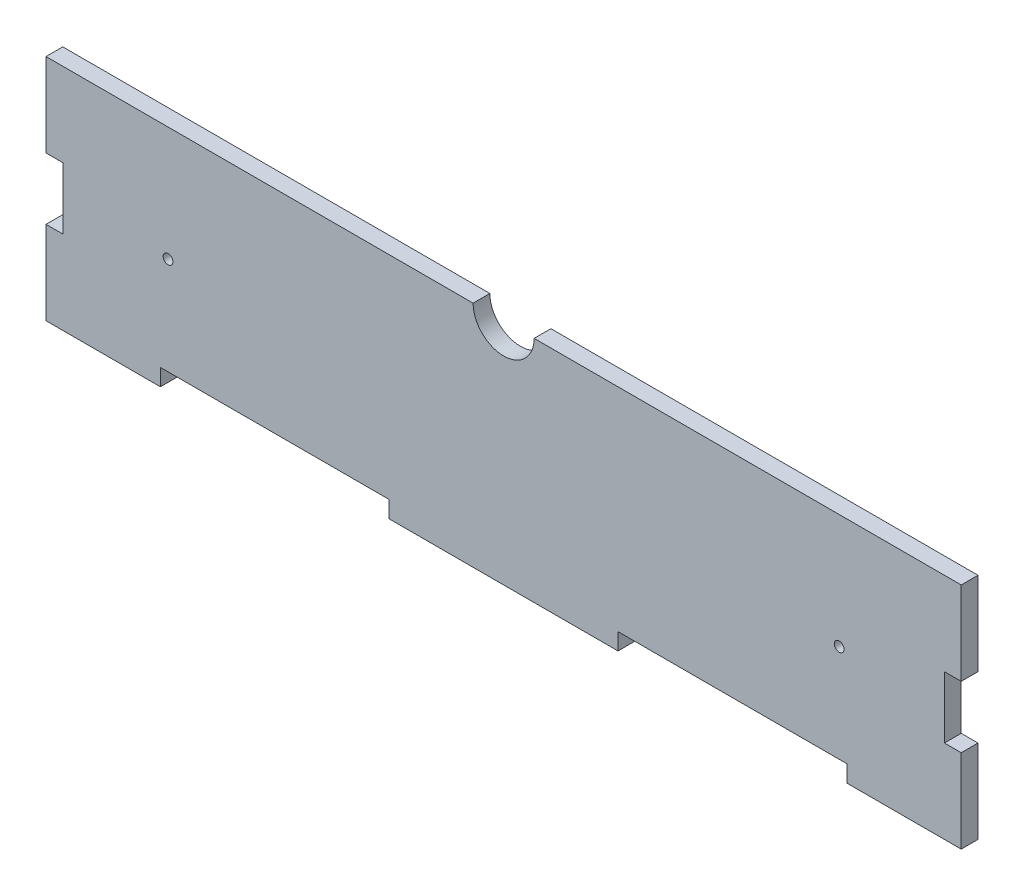
ISO-10303-21;
HEADER;
FILE_DESCRIPTION(('STEP AP214'),'2;1');
FILE_NAME('part.step','',(''),(''),'','','');
FILE_SCHEMA(('AUTOMOTIVE_DESIGN { 1 0 10303 214 1 1 1 1 }'));
ENDSEC;
DATA;
#1=APPLICATION_CONTEXT('core data for automotive mechanical design processes');
#2=APPLICATION_PROTOCOL_DEFINITION('international standard','automotive_design',2000,#1);
#3=PRODUCT_CONTEXT('',#1,'mechanical');
#4=PRODUCT('Part','Part','',(#3));
#5=PRODUCT_RELATED_PRODUCT_CATEGORY('part','',(#4));
#6=PRODUCT_DEFINITION_FORMATION('','',#4);
#7=PRODUCT_DEFINITION_CONTEXT('part definition',#1,'design');
#8=PRODUCT_DEFINITION('design','',#6,#7);
#9=PRODUCT_DEFINITION_SHAPE('','',#8);
#10=(LENGTH_UNIT() NAMED_UNIT(*) SI_UNIT(.MILLI.,.METRE.));
#11=(NAMED_UNIT(*) PLANE_ANGLE_UNIT() SI_UNIT($,.RADIAN.));
#12=(NAMED_UNIT(*) SI_UNIT($,.STERADIAN.) SOLID_ANGLE_UNIT());
#13=UNCERTAINTY_MEASURE_WITH_UNIT(LENGTH_MEASURE(1.E-05),#10,'distance_accuracy_value','');
#14=(GEOMETRIC_REPRESENTATION_CONTEXT(3) GLOBAL_UNCERTAINTY_ASSIGNED_CONTEXT((#13)) GLOBAL_UNIT_ASSIGNED_CONTEXT((#10,
#11,#12)) REPRESENTATION_CONTEXT('',''));
#15=CARTESIAN_POINT('',(0.,0.,0.));
#16=DIRECTION('',(0.,0.,1.));
#17=DIRECTION('',(1.,0.,0.));
#18=AXIS2_PLACEMENT_3D('',#15,#16,#17);
#19=CARTESIAN_POINT('',(300.,78.,5.5));
#20=DIRECTION('',(0.,-1.,0.));
#21=DIRECTION('',(0.,0.,-1.));
#22=AXIS2_PLACEMENT_3D('',#19,#20,#21);
#23=PLANE('',#22);
#24=DIRECTION('',(0.,0.,-1.));
#25=VECTOR('',#24,1.);
#26=CARTESIAN_POINT('',(140.,78.,5.5));
#27=LINE('',#26,#25);
#28=CARTESIAN_POINT('',(140.,78.,0.));
#29=VERTEX_POINT('',#28);
#30=CARTESIAN_POINT('',(140.,78.,5.5));
#31=VERTEX_POINT('',#30);
#32=EDGE_CURVE('E365',#29,#31,#27,.F.);
#33=ORIENTED_EDGE('',*,*,#32,.F.);
#34=DIRECTION('',(-1.,0.,0.));
#35=VECTOR('',#34,1.);
#36=CARTESIAN_POINT('',(300.,78.,0.));
#37=LINE('',#36,#35);
#38=CARTESIAN_POINT('',(0.,78.,0.));
#39=VERTEX_POINT('',#38);
#40=EDGE_CURVE('E228',#29,#39,#37,.T.);
#41=ORIENTED_EDGE('',*,*,#40,.T.);
#42=DIRECTION('',(0.,0.,-1.));
#43=VECTOR('',#42,1.);
#44=CARTESIAN_POINT('',(0.,78.,5.5));
#45=LINE('',#44,#43);
#46=CARTESIAN_POINT('',(0.,78.,5.5));
#47=VERTEX_POINT('',#46);
#48=EDGE_CURVE('E47',#47,#39,#45,.T.);
#49=ORIENTED_EDGE('',*,*,#48,.F.);
#50=DIRECTION('',(-1.,0.,0.));
#51=VECTOR('',#50,1.);
#52=CARTESIAN_POINT('',(300.,78.,5.5));
#53=LINE('',#52,#51);
#54=EDGE_CURVE('E139',#31,#47,#53,.T.);
#55=ORIENTED_EDGE('',*,*,#54,.F.);
#56=EDGE_LOOP('',(#33,#41,#49,#55));
#57=FACE_BOUND('',#56,.T.);
#58=ADVANCED_FACE('F39',(#57),#23,.F.);
#59=DIRECTION('',(0.,0.,-1.));
#60=VECTOR('',#59,1.);
#61=CARTESIAN_POINT('',(160.,78.,5.5));
#62=LINE('',#61,#60);
#63=CARTESIAN_POINT('',(160.,78.,5.5));
#64=VERTEX_POINT('',#63);
#65=CARTESIAN_POINT('',(160.,78.,0.));
#66=VERTEX_POINT('',#65);
#67=EDGE_CURVE('E53',#64,#66,#62,.T.);
#68=ORIENTED_EDGE('',*,*,#67,.F.);
#69=CARTESIAN_POINT('',(300.,78.,5.5));
#70=VERTEX_POINT('',#69);
#71=EDGE_CURVE('E440',#70,#64,#53,.T.);
#72=ORIENTED_EDGE('',*,*,#71,.F.);
#73=DIRECTION('',(0.,0.,-1.));
#74=VECTOR('',#73,1.);
#75=CARTESIAN_POINT('',(300.,78.,5.5));
#76=LINE('',#75,#74);
#77=CARTESIAN_POINT('',(300.,78.,0.));
#78=VERTEX_POINT('',#77);
#79=EDGE_CURVE('E219',#70,#78,#76,.T.);
#80=ORIENTED_EDGE('',*,*,#79,.T.);
#81=EDGE_CURVE('E223',#78,#66,#37,.T.);
#82=ORIENTED_EDGE('',*,*,#81,.T.);
#83=EDGE_LOOP('',(#68,#72,#80,#82));
#84=FACE_BOUND('',#83,.T.);
#85=ADVANCED_FACE('F441',(#84),#23,.F.);
#86=CARTESIAN_POINT('',(0.,78.,5.5));
#87=DIRECTION('',(1.,0.,0.));
#88=DIRECTION('',(0.,0.,-1.));
#89=AXIS2_PLACEMENT_3D('',#86,#87,#88);
#90=PLANE('',#89);
#91=DIRECTION('',(0.,-1.,0.));
#92=VECTOR('',#91,1.);
#93=CARTESIAN_POINT('',(0.,78.,0.));
#94=LINE('',#93,#92);
#95=CARTESIAN_POINT('',(0.,50.625,0.));
#96=VERTEX_POINT('',#95);
#97=EDGE_CURVE('E227',#39,#96,#94,.T.);
#98=ORIENTED_EDGE('',*,*,#97,.T.);
#99=DIRECTION('',(0.,0.,-1.));
#100=VECTOR('',#99,1.);
#101=CARTESIAN_POINT('',(0.,50.625,5.5));
#102=LINE('',#101,#100);
#103=CARTESIAN_POINT('',(0.,50.625,5.5));
#104=VERTEX_POINT('',#103);
#105=EDGE_CURVE('E349',#104,#96,#102,.T.);
#106=ORIENTED_EDGE('',*,*,#105,.F.);
#107=DIRECTION('',(0.,-1.,0.));
#108=VECTOR('',#107,1.);
#109=CARTESIAN_POINT('',(0.,78.,5.5));
#110=LINE('',#109,#108);
#111=EDGE_CURVE('E359',#47,#104,#110,.T.);
#112=ORIENTED_EDGE('',*,*,#111,.F.);
#113=ORIENTED_EDGE('',*,*,#48,.T.);
#114=EDGE_LOOP('',(#98,#106,#112,#113));
#115=FACE_BOUND('',#114,.T.);
#116=ADVANCED_FACE('F356',(#115),#90,.F.);
#117=CARTESIAN_POINT('',(0.,50.625,5.5));
#118=DIRECTION('',(0.,1.,0.));
#119=DIRECTION('',(0.,0.,1.));
#120=AXIS2_PLACEMENT_3D('',#117,#118,#119);
#121=PLANE('',#120);
#122=DIRECTION('',(1.,0.,0.));
#123=VECTOR('',#122,1.);
#124=CARTESIAN_POINT('',(0.,50.625,0.));
#125=LINE('',#124,#123);
#126=CARTESIAN_POINT('',(5.5,50.625,0.));
#127=VERTEX_POINT('',#126);
#128=EDGE_CURVE('E231',#96,#127,#125,.T.);
#129=ORIENTED_EDGE('',*,*,#128,.T.);
#130=DIRECTION('',(0.,0.,-1.));
#131=VECTOR('',#130,1.);
#132=CARTESIAN_POINT('',(5.5,50.625,5.5));
#133=LINE('',#132,#131);
#134=CARTESIAN_POINT('',(5.5,50.625,5.5));
#135=VERTEX_POINT('',#134);
#136=EDGE_CURVE('E345',#135,#127,#133,.T.);
#137=ORIENTED_EDGE('',*,*,#136,.F.);
#138=DIRECTION('',(1.,0.,0.));
#139=VECTOR('',#138,1.);
#140=CARTESIAN_POINT('',(0.,50.625,5.5));
#141=LINE('',#140,#139);
#142=EDGE_CURVE('E384',#104,#135,#141,.T.);
#143=ORIENTED_EDGE('',*,*,#142,.F.);
#144=ORIENTED_EDGE('',*,*,#105,.T.);
#145=EDGE_LOOP('',(#129,#137,#143,#144));
#146=FACE_BOUND('',#145,.T.);
#147=ADVANCED_FACE('F374',(#146),#121,.F.);
#148=CARTESIAN_POINT('',(5.5,38.875,5.5));
#149=DIRECTION('',(1.,0.,0.));
#150=DIRECTION('',(0.,0.,-1.));
#151=AXIS2_PLACEMENT_3D('',#148,#149,#150);
#152=PLANE('',#151);
#153=DIRECTION('',(0.,-1.,0.));
#154=VECTOR('',#153,1.);
#155=CARTESIAN_POINT('',(5.5,38.875,0.));
#156=LINE('',#155,#154);
#157=CARTESIAN_POINT('',(5.5,30.375,0.));
#158=VERTEX_POINT('',#157);
#159=EDGE_CURVE('E235',#127,#158,#156,.T.);
#160=ORIENTED_EDGE('',*,*,#159,.T.);
#161=DIRECTION('',(0.,0.,-1.));
#162=VECTOR('',#161,1.);
#163=CARTESIAN_POINT('',(5.5,30.375,5.5));
#164=LINE('',#163,#162);
#165=CARTESIAN_POINT('',(5.5,30.375,5.5));
#166=VERTEX_POINT('',#165);
#167=EDGE_CURVE('E341',#166,#158,#164,.T.);
#168=ORIENTED_EDGE('',*,*,#167,.F.);
#169=DIRECTION('',(0.,-1.,0.));
#170=VECTOR('',#169,1.);
#171=CARTESIAN_POINT('',(5.5,50.625,5.5));
#172=LINE('',#171,#170);
#173=EDGE_CURVE('E380',#135,#166,#172,.T.);
#174=ORIENTED_EDGE('',*,*,#173,.F.);
#175=ORIENTED_EDGE('',*,*,#136,.T.);
#176=EDGE_LOOP('',(#160,#168,#174,#175));
#177=FACE_BOUND('',#176,.T.);
#178=ADVANCED_FACE('F378',(#177),#152,.F.);
#179=CARTESIAN_POINT('',(5.5,30.375,5.5));
#180=DIRECTION('',(0.,-1.,0.));
#181=DIRECTION('',(0.,0.,-1.));
#182=AXIS2_PLACEMENT_3D('',#179,#180,#181);
#183=PLANE('',#182);
#184=DIRECTION('',(-1.,0.,0.));
#185=VECTOR('',#184,1.);
#186=CARTESIAN_POINT('',(5.5,30.375,0.));
#187=LINE('',#186,#185);
#188=CARTESIAN_POINT('',(0.,30.375,0.));
#189=VERTEX_POINT('',#188);
#190=EDGE_CURVE('E238',#158,#189,#187,.T.);
#191=ORIENTED_EDGE('',*,*,#190,.T.);
#192=DIRECTION('',(0.,0.,-1.));
#193=VECTOR('',#192,1.);
#194=CARTESIAN_POINT('',(0.,30.375,5.5));
#195=LINE('',#194,#193);
#196=CARTESIAN_POINT('',(0.,30.375,5.5));
#197=VERTEX_POINT('',#196);
#198=EDGE_CURVE('E337',#197,#189,#195,.T.);
#199=ORIENTED_EDGE('',*,*,#198,.F.);
#200=DIRECTION('',(-1.,0.,0.));
#201=VECTOR('',#200,1.);
#202=CARTESIAN_POINT('',(5.5,30.375,5.5));
#203=LINE('',#202,#201);
#204=EDGE_CURVE('E383',#166,#197,#203,.T.);
#205=ORIENTED_EDGE('',*,*,#204,.F.);
#206=ORIENTED_EDGE('',*,*,#167,.T.);
#207=EDGE_LOOP('',(#191,#199,#205,#206));
#208=FACE_BOUND('',#207,.T.);
#209=ADVANCED_FACE('F507',(#208),#183,.F.);
#210=CARTESIAN_POINT('',(0.,30.375,5.5));
#211=DIRECTION('',(1.,0.,0.));
#212=DIRECTION('',(0.,0.,-1.));
#213=AXIS2_PLACEMENT_3D('',#210,#211,#212);
#214=PLANE('',#213);
#215=DIRECTION('',(0.,-1.,0.));
#216=VECTOR('',#215,1.);
#217=CARTESIAN_POINT('',(0.,30.375,0.));
#218=LINE('',#217,#216);
#219=CARTESIAN_POINT('',(0.,3.,0.));
#220=VERTEX_POINT('',#219);
#221=EDGE_CURVE('E241',#189,#220,#218,.T.);
#222=ORIENTED_EDGE('',*,*,#221,.T.);
#223=DIRECTION('',(0.,0.,-1.));
#224=VECTOR('',#223,1.);
#225=CARTESIAN_POINT('',(0.,3.,5.5));
#226=LINE('',#225,#224);
#227=CARTESIAN_POINT('',(0.,3.,5.5));
#228=VERTEX_POINT('',#227);
#229=EDGE_CURVE('E333',#228,#220,#226,.T.);
#230=ORIENTED_EDGE('',*,*,#229,.F.);
#231=DIRECTION('',(0.,-1.,0.));
#232=VECTOR('',#231,1.);
#233=CARTESIAN_POINT('',(0.,30.375,5.5));
#234=LINE('',#233,#232);
#235=EDGE_CURVE('E388',#197,#228,#234,.T.);
#236=ORIENTED_EDGE('',*,*,#235,.F.);
#237=ORIENTED_EDGE('',*,*,#198,.T.);
#238=EDGE_LOOP('',(#222,#230,#236,#237));
#239=FACE_BOUND('',#238,.T.);
#240=ADVANCED_FACE('F510',(#239),#214,.F.);
#241=CARTESIAN_POINT('',(0.,3.,5.5));
#242=DIRECTION('',(0.,1.,0.));
#243=DIRECTION('',(0.,0.,1.));
#244=AXIS2_PLACEMENT_3D('',#241,#242,#243);
#245=PLANE('',#244);
#246=DIRECTION('',(1.,0.,0.));
#247=VECTOR('',#246,1.);
#248=CARTESIAN_POINT('',(0.,3.,0.));
#249=LINE('',#248,#247);
#250=CARTESIAN_POINT('',(37.5,3.,0.));
#251=VERTEX_POINT('',#250);
#252=EDGE_CURVE('E244',#220,#251,#249,.T.);
#253=ORIENTED_EDGE('',*,*,#252,.T.);
#254=DIRECTION('',(0.,0.,-1.));
#255=VECTOR('',#254,1.);
#256=CARTESIAN_POINT('',(37.5,3.,5.5));
#257=LINE('',#256,#255);
#258=CARTESIAN_POINT('',(37.5,3.,5.5));
#259=VERTEX_POINT('',#258);
#260=EDGE_CURVE('E329',#259,#251,#257,.T.);
#261=ORIENTED_EDGE('',*,*,#260,.F.);
#262=DIRECTION('',(1.,0.,0.));
#263=VECTOR('',#262,1.);
#264=CARTESIAN_POINT('',(0.,3.,5.5));
#265=LINE('',#264,#263);
#266=EDGE_CURVE('E395',#228,#259,#265,.T.);
#267=ORIENTED_EDGE('',*,*,#266,.F.);
#268=ORIENTED_EDGE('',*,*,#229,.T.);
#269=EDGE_LOOP('',(#253,#261,#267,#268));
#270=FACE_BOUND('',#269,.T.);
#271=ADVANCED_FACE('F514',(#270),#245,.F.);
#272=CARTESIAN_POINT('',(37.5,3.,5.5));
#273=DIRECTION('',(-1.,0.,0.));
#274=DIRECTION('',(0.,0.,1.));
#275=AXIS2_PLACEMENT_3D('',#272,#273,#274);
#276=PLANE('',#275);
#277=DIRECTION('',(0.,1.,0.));
#278=VECTOR('',#277,1.);
#279=CARTESIAN_POINT('',(37.5,3.,0.));
#280=LINE('',#279,#278);
#281=CARTESIAN_POINT('',(37.5,8.5,0.));
#282=VERTEX_POINT('',#281);
#283=EDGE_CURVE('E247',#251,#282,#280,.T.);
#284=ORIENTED_EDGE('',*,*,#283,.T.);
#285=DIRECTION('',(0.,0.,-1.));
#286=VECTOR('',#285,1.);
#287=CARTESIAN_POINT('',(37.5,8.5,5.5));
#288=LINE('',#287,#286);
#289=CARTESIAN_POINT('',(37.5,8.5,5.5));
#290=VERTEX_POINT('',#289);
#291=EDGE_CURVE('E325',#290,#282,#288,.T.);
#292=ORIENTED_EDGE('',*,*,#291,.F.);
#293=DIRECTION('',(0.,1.,0.));
#294=VECTOR('',#293,1.);
#295=CARTESIAN_POINT('',(37.5,3.,5.5));
#296=LINE('',#295,#294);
#297=EDGE_CURVE('E398',#259,#290,#296,.T.);
#298=ORIENTED_EDGE('',*,*,#297,.F.);
#299=ORIENTED_EDGE('',*,*,#260,.T.);
#300=EDGE_LOOP('',(#284,#292,#298,#299));
#301=FACE_BOUND('',#300,.T.);
#302=ADVANCED_FACE('F518',(#301),#276,.F.);
#303=CARTESIAN_POINT('',(76.625,8.5,5.5));
#304=DIRECTION('',(0.,1.,0.));
#305=DIRECTION('',(0.,0.,1.));
#306=AXIS2_PLACEMENT_3D('',#303,#304,#305);
#307=PLANE('',#306);
#308=DIRECTION('',(1.,0.,0.));
#309=VECTOR('',#308,1.);
#310=CARTESIAN_POINT('',(76.625,8.5,0.));
#311=LINE('',#310,#309);
#312=CARTESIAN_POINT('',(112.5,8.5,0.));
#313=VERTEX_POINT('',#312);
#314=EDGE_CURVE('E251',#282,#313,#311,.T.);
#315=ORIENTED_EDGE('',*,*,#314,.T.);
#316=DIRECTION('',(0.,0.,-1.));
#317=VECTOR('',#316,1.);
#318=CARTESIAN_POINT('',(112.5,8.5,5.5));
#319=LINE('',#318,#317);
#320=CARTESIAN_POINT('',(112.5,8.5,5.5));
#321=VERTEX_POINT('',#320);
#322=EDGE_CURVE('E321',#321,#313,#319,.T.);
#323=ORIENTED_EDGE('',*,*,#322,.F.);
#324=DIRECTION('',(1.,0.,0.));
#325=VECTOR('',#324,1.);
#326=CARTESIAN_POINT('',(37.5,8.5,5.5));
#327=LINE('',#326,#325);
#328=EDGE_CURVE('E401',#290,#321,#327,.T.);
#329=ORIENTED_EDGE('',*,*,#328,.F.);
#330=ORIENTED_EDGE('',*,*,#291,.T.);
#331=EDGE_LOOP('',(#315,#323,#329,#330));
#332=FACE_BOUND('',#331,.T.);
#333=ADVANCED_FACE('F522',(#332),#307,.F.);
#334=CARTESIAN_POINT('',(112.5,8.5,5.5));
#335=DIRECTION('',(1.,0.,0.));
#336=DIRECTION('',(0.,0.,-1.));
#337=AXIS2_PLACEMENT_3D('',#334,#335,#336);
#338=PLANE('',#337);
#339=DIRECTION('',(0.,-1.,0.));
#340=VECTOR('',#339,1.);
#341=CARTESIAN_POINT('',(112.5,8.5,0.));
#342=LINE('',#341,#340);
#343=CARTESIAN_POINT('',(112.5,3.,0.));
#344=VERTEX_POINT('',#343);
#345=EDGE_CURVE('E254',#313,#344,#342,.T.);
#346=ORIENTED_EDGE('',*,*,#345,.T.);
#347=DIRECTION('',(0.,0.,-1.));
#348=VECTOR('',#347,1.);
#349=CARTESIAN_POINT('',(112.5,3.,5.5));
#350=LINE('',#349,#348);
#351=CARTESIAN_POINT('',(112.5,3.,5.5));
#352=VERTEX_POINT('',#351);
#353=EDGE_CURVE('E317',#352,#344,#350,.T.);
#354=ORIENTED_EDGE('',*,*,#353,.F.);
#355=DIRECTION('',(0.,-1.,0.));
#356=VECTOR('',#355,1.);
#357=CARTESIAN_POINT('',(112.5,8.5,5.5));
#358=LINE('',#357,#356);
#359=EDGE_CURVE('E404',#321,#352,#358,.T.);
#360=ORIENTED_EDGE('',*,*,#359,.F.);
#361=ORIENTED_EDGE('',*,*,#322,.T.);
#362=EDGE_LOOP('',(#346,#354,#360,#361));
#363=FACE_BOUND('',#362,.T.);
#364=ADVANCED_FACE('F526',(#363),#338,.F.);
#365=CARTESIAN_POINT('',(112.5,3.,5.5));
#366=DIRECTION('',(0.,1.,0.));
#367=DIRECTION('',(0.,0.,1.));
#368=AXIS2_PLACEMENT_3D('',#365,#366,#367);
#369=PLANE('',#368);
#370=DIRECTION('',(1.,0.,0.));
#371=VECTOR('',#370,1.);
#372=CARTESIAN_POINT('',(112.5,3.,0.));
#373=LINE('',#372,#371);
#374=CARTESIAN_POINT('',(187.5,3.,0.));
#375=VERTEX_POINT('',#374);
#376=EDGE_CURVE('E257',#344,#375,#373,.T.);
#377=ORIENTED_EDGE('',*,*,#376,.T.);
#378=DIRECTION('',(0.,0.,-1.));
#379=VECTOR('',#378,1.);
#380=CARTESIAN_POINT('',(187.5,3.,5.5));
#381=LINE('',#380,#379);
#382=CARTESIAN_POINT('',(187.5,3.,5.5));
#383=VERTEX_POINT('',#382);
#384=EDGE_CURVE('E313',#383,#375,#381,.T.);
#385=ORIENTED_EDGE('',*,*,#384,.F.);
#386=DIRECTION('',(1.,0.,0.));
#387=VECTOR('',#386,1.);
#388=CARTESIAN_POINT('',(112.5,3.,5.5));
#389=LINE('',#388,#387);
#390=EDGE_CURVE('E407',#352,#383,#389,.T.);
#391=ORIENTED_EDGE('',*,*,#390,.F.);
#392=ORIENTED_EDGE('',*,*,#353,.T.);
#393=EDGE_LOOP('',(#377,#385,#391,#392));
#394=FACE_BOUND('',#393,.T.);
#395=ADVANCED_FACE('F530',(#394),#369,.F.);
#396=CARTESIAN_POINT('',(187.5,3.,5.5));
#397=DIRECTION('',(-1.,0.,0.));
#398=DIRECTION('',(0.,0.,1.));
#399=AXIS2_PLACEMENT_3D('',#396,#397,#398);
#400=PLANE('',#399);
#401=DIRECTION('',(0.,1.,0.));
#402=VECTOR('',#401,1.);
#403=CARTESIAN_POINT('',(187.5,3.,0.));
#404=LINE('',#403,#402);
#405=CARTESIAN_POINT('',(187.5,8.5,0.));
#406=VERTEX_POINT('',#405);
#407=EDGE_CURVE('E260',#375,#406,#404,.T.);
#408=ORIENTED_EDGE('',*,*,#407,.T.);
#409=DIRECTION('',(0.,0.,-1.));
#410=VECTOR('',#409,1.);
#411=CARTESIAN_POINT('',(187.5,8.5,5.5));
#412=LINE('',#411,#410);
#413=CARTESIAN_POINT('',(187.5,8.5,5.5));
#414=VERTEX_POINT('',#413);
#415=EDGE_CURVE('E309',#414,#406,#412,.T.);
#416=ORIENTED_EDGE('',*,*,#415,.F.);
#417=DIRECTION('',(0.,1.,0.));
#418=VECTOR('',#417,1.);
#419=CARTESIAN_POINT('',(187.5,3.,5.5));
#420=LINE('',#419,#418);
#421=EDGE_CURVE('E410',#383,#414,#420,.T.);
#422=ORIENTED_EDGE('',*,*,#421,.F.);
#423=ORIENTED_EDGE('',*,*,#384,.T.);
#424=EDGE_LOOP('',(#408,#416,#422,#423));
#425=FACE_BOUND('',#424,.T.);
#426=ADVANCED_FACE('F534',(#425),#400,.F.);
#427=CARTESIAN_POINT('',(226.625,8.5,5.5));
#428=DIRECTION('',(0.,1.,0.));
#429=DIRECTION('',(0.,0.,1.));
#430=AXIS2_PLACEMENT_3D('',#427,#428,#429);
#431=PLANE('',#430);
#432=DIRECTION('',(1.,0.,0.));
#433=VECTOR('',#432,1.);
#434=CARTESIAN_POINT('',(226.625,8.5,0.));
#435=LINE('',#434,#433);
#436=CARTESIAN_POINT('',(262.5,8.5,0.));
#437=VERTEX_POINT('',#436);
#438=EDGE_CURVE('E264',#406,#437,#435,.T.);
#439=ORIENTED_EDGE('',*,*,#438,.T.);
#440=DIRECTION('',(0.,0.,-1.));
#441=VECTOR('',#440,1.);
#442=CARTESIAN_POINT('',(262.5,8.5,5.5));
#443=LINE('',#442,#441);
#444=CARTESIAN_POINT('',(262.5,8.5,5.5));
#445=VERTEX_POINT('',#444);
#446=EDGE_CURVE('E305',#445,#437,#443,.T.);
#447=ORIENTED_EDGE('',*,*,#446,.F.);
#448=DIRECTION('',(1.,0.,0.));
#449=VECTOR('',#448,1.);
#450=CARTESIAN_POINT('',(187.5,8.5,5.5));
#451=LINE('',#450,#449);
#452=EDGE_CURVE('E413',#414,#445,#451,.T.);
#453=ORIENTED_EDGE('',*,*,#452,.F.);
#454=ORIENTED_EDGE('',*,*,#415,.T.);
#455=EDGE_LOOP('',(#439,#447,#453,#454));
#456=FACE_BOUND('',#455,.T.);
#457=ADVANCED_FACE('F538',(#456),#431,.F.);
#458=CARTESIAN_POINT('',(262.5,8.5,5.5));
#459=DIRECTION('',(1.,0.,0.));
#460=DIRECTION('',(0.,0.,-1.));
#461=AXIS2_PLACEMENT_3D('',#458,#459,#460);
#462=PLANE('',#461);
#463=DIRECTION('',(0.,-1.,0.));
#464=VECTOR('',#463,1.);
#465=CARTESIAN_POINT('',(262.5,8.5,0.));
#466=LINE('',#465,#464);
#467=CARTESIAN_POINT('',(262.5,3.,0.));
#468=VERTEX_POINT('',#467);
#469=EDGE_CURVE('E267',#437,#468,#466,.T.);
#470=ORIENTED_EDGE('',*,*,#469,.T.);
#471=DIRECTION('',(0.,0.,-1.));
#472=VECTOR('',#471,1.);
#473=CARTESIAN_POINT('',(262.5,3.,5.5));
#474=LINE('',#473,#472);
#475=CARTESIAN_POINT('',(262.5,3.,5.5));
#476=VERTEX_POINT('',#475);
#477=EDGE_CURVE('E301',#476,#468,#474,.T.);
#478=ORIENTED_EDGE('',*,*,#477,.F.);
#479=DIRECTION('',(0.,-1.,0.));
#480=VECTOR('',#479,1.);
#481=CARTESIAN_POINT('',(262.5,8.5,5.5));
#482=LINE('',#481,#480);
#483=EDGE_CURVE('E416',#445,#476,#482,.T.);
#484=ORIENTED_EDGE('',*,*,#483,.F.);
#485=ORIENTED_EDGE('',*,*,#446,.T.);
#486=EDGE_LOOP('',(#470,#478,#484,#485));
#487=FACE_BOUND('',#486,.T.);
#488=ADVANCED_FACE('F542',(#487),#462,.F.);
#489=CARTESIAN_POINT('',(262.5,3.,5.5));
#490=DIRECTION('',(0.,1.,0.));
#491=DIRECTION('',(0.,0.,1.));
#492=AXIS2_PLACEMENT_3D('',#489,#490,#491);
#493=PLANE('',#492);
#494=DIRECTION('',(1.,0.,0.));
#495=VECTOR('',#494,1.);
#496=CARTESIAN_POINT('',(262.5,3.,0.));
#497=LINE('',#496,#495);
#498=CARTESIAN_POINT('',(300.,3.,0.));
#499=VERTEX_POINT('',#498);
#500=EDGE_CURVE('E270',#468,#499,#497,.T.);
#501=ORIENTED_EDGE('',*,*,#500,.T.);
#502=DIRECTION('',(0.,0.,-1.));
#503=VECTOR('',#502,1.);
#504=CARTESIAN_POINT('',(300.,3.,5.5));
#505=LINE('',#504,#503);
#506=CARTESIAN_POINT('',(300.,3.,5.5));
#507=VERTEX_POINT('',#506);
#508=EDGE_CURVE('E297',#507,#499,#505,.T.);
#509=ORIENTED_EDGE('',*,*,#508,.F.);
#510=DIRECTION('',(1.,0.,0.));
#511=VECTOR('',#510,1.);
#512=CARTESIAN_POINT('',(262.5,3.,5.5));
#513=LINE('',#512,#511);
#514=EDGE_CURVE('E419',#476,#507,#513,.T.);
#515=ORIENTED_EDGE('',*,*,#514,.F.);
#516=ORIENTED_EDGE('',*,*,#477,.T.);
#517=EDGE_LOOP('',(#501,#509,#515,#516));
#518=FACE_BOUND('',#517,.T.);
#519=ADVANCED_FACE('F546',(#518),#493,.F.);
#520=CARTESIAN_POINT('',(300.,3.,5.5));
#521=DIRECTION('',(-1.,0.,0.));
#522=DIRECTION('',(0.,0.,1.));
#523=AXIS2_PLACEMENT_3D('',#520,#521,#522);
#524=PLANE('',#523);
#525=DIRECTION('',(0.,1.,0.));
#526=VECTOR('',#525,1.);
#527=CARTESIAN_POINT('',(300.,3.,0.));
#528=LINE('',#527,#526);
#529=CARTESIAN_POINT('',(300.,30.375,0.));
#530=VERTEX_POINT('',#529);
#531=EDGE_CURVE('E273',#499,#530,#528,.T.);
#532=ORIENTED_EDGE('',*,*,#531,.T.);
#533=DIRECTION('',(0.,0.,-1.));
#534=VECTOR('',#533,1.);
#535=CARTESIAN_POINT('',(300.,30.375,5.5));
#536=LINE('',#535,#534);
#537=CARTESIAN_POINT('',(300.,30.375,5.5));
#538=VERTEX_POINT('',#537);
#539=EDGE_CURVE('E293',#538,#530,#536,.T.);
#540=ORIENTED_EDGE('',*,*,#539,.F.);
#541=DIRECTION('',(0.,1.,0.));
#542=VECTOR('',#541,1.);
#543=CARTESIAN_POINT('',(300.,3.,5.5));
#544=LINE('',#543,#542);
#545=EDGE_CURVE('E422',#507,#538,#544,.T.);
#546=ORIENTED_EDGE('',*,*,#545,.F.);
#547=ORIENTED_EDGE('',*,*,#508,.T.);
#548=EDGE_LOOP('',(#532,#540,#546,#547));
#549=FACE_BOUND('',#548,.T.);
#550=ADVANCED_FACE('F430',(#549),#524,.F.);
#551=CARTESIAN_POINT('',(300.,30.375,5.5));
#552=DIRECTION('',(0.,-1.,0.));
#553=DIRECTION('',(0.,0.,-1.));
#554=AXIS2_PLACEMENT_3D('',#551,#552,#553);
#555=PLANE('',#554);
#556=DIRECTION('',(-1.,0.,0.));
#557=VECTOR('',#556,1.);
#558=CARTESIAN_POINT('',(300.,30.375,0.));
#559=LINE('',#558,#557);
#560=CARTESIAN_POINT('',(294.5,30.375,0.));
#561=VERTEX_POINT('',#560);
#562=EDGE_CURVE('E276',#530,#561,#559,.T.);
#563=ORIENTED_EDGE('',*,*,#562,.T.);
#564=DIRECTION('',(0.,0.,-1.));
#565=VECTOR('',#564,1.);
#566=CARTESIAN_POINT('',(294.5,30.375,5.5));
#567=LINE('',#566,#565);
#568=CARTESIAN_POINT('',(294.5,30.375,5.5));
#569=VERTEX_POINT('',#568);
#570=EDGE_CURVE('E212',#569,#561,#567,.T.);
#571=ORIENTED_EDGE('',*,*,#570,.F.);
#572=DIRECTION('',(-1.,0.,0.));
#573=VECTOR('',#572,1.);
#574=CARTESIAN_POINT('',(300.,30.375,5.5));
#575=LINE('',#574,#573);
#576=EDGE_CURVE('E199',#538,#569,#575,.T.);
#577=ORIENTED_EDGE('',*,*,#576,.F.);
#578=ORIENTED_EDGE('',*,*,#539,.T.);
#579=EDGE_LOOP('',(#563,#571,#577,#578));
#580=FACE_BOUND('',#579,.T.);
#581=ADVANCED_FACE('F434',(#580),#555,.F.);
#582=CARTESIAN_POINT('',(294.5,42.125,5.5));
#583=DIRECTION('',(-1.,0.,0.));
#584=DIRECTION('',(0.,0.,1.));
#585=AXIS2_PLACEMENT_3D('',#582,#583,#584);
#586=PLANE('',#585);
#587=DIRECTION('',(0.,1.,0.));
#588=VECTOR('',#587,1.);
#589=CARTESIAN_POINT('',(294.5,42.125,0.));
#590=LINE('',#589,#588);
#591=CARTESIAN_POINT('',(294.5,50.625,0.));
#592=VERTEX_POINT('',#591);
#593=EDGE_CURVE('E208',#561,#592,#590,.T.);
#594=ORIENTED_EDGE('',*,*,#593,.T.);
#595=DIRECTION('',(0.,0.,-1.));
#596=VECTOR('',#595,1.);
#597=CARTESIAN_POINT('',(294.5,50.625,5.5));
#598=LINE('',#597,#596);
#599=CARTESIAN_POINT('',(294.5,50.625,5.5));
#600=VERTEX_POINT('',#599);
#601=EDGE_CURVE('E206',#600,#592,#598,.T.);
#602=ORIENTED_EDGE('',*,*,#601,.F.);
#603=DIRECTION('',(0.,1.,0.));
#604=VECTOR('',#603,1.);
#605=CARTESIAN_POINT('',(294.5,30.375,5.5));
#606=LINE('',#605,#604);
#607=EDGE_CURVE('E191',#569,#600,#606,.T.);
#608=ORIENTED_EDGE('',*,*,#607,.F.);
#609=ORIENTED_EDGE('',*,*,#570,.T.);
#610=EDGE_LOOP('',(#594,#602,#608,#609));
#611=FACE_BOUND('',#610,.T.);
#612=ADVANCED_FACE('F207',(#611),#586,.F.);
#613=CARTESIAN_POINT('',(294.5,50.625,5.5));
#614=DIRECTION('',(0.,1.,0.));
#615=DIRECTION('',(0.,0.,1.));
#616=AXIS2_PLACEMENT_3D('',#613,#614,#615);
#617=PLANE('',#616);
#618=DIRECTION('',(1.,0.,0.));
#619=VECTOR('',#618,1.);
#620=CARTESIAN_POINT('',(294.5,50.625,0.));
#621=LINE('',#620,#619);
#622=CARTESIAN_POINT('',(300.,50.625,0.));
#623=VERTEX_POINT('',#622);
#624=EDGE_CURVE('E282',#592,#623,#621,.T.);
#625=ORIENTED_EDGE('',*,*,#624,.T.);
#626=DIRECTION('',(0.,0.,-1.));
#627=VECTOR('',#626,1.);
#628=CARTESIAN_POINT('',(300.,50.625,5.5));
#629=LINE('',#628,#627);
#630=CARTESIAN_POINT('',(300.,50.625,5.5));
#631=VERTEX_POINT('',#630);
#632=EDGE_CURVE('E213',#631,#623,#629,.T.);
#633=ORIENTED_EDGE('',*,*,#632,.F.);
#634=DIRECTION('',(1.,0.,0.));
#635=VECTOR('',#634,1.);
#636=CARTESIAN_POINT('',(294.5,50.625,5.5));
#637=LINE('',#636,#635);
#638=EDGE_CURVE('E196',#600,#631,#637,.T.);
#639=ORIENTED_EDGE('',*,*,#638,.F.);
#640=ORIENTED_EDGE('',*,*,#601,.T.);
#641=EDGE_LOOP('',(#625,#633,#639,#640));
#642=FACE_BOUND('',#641,.T.);
#643=ADVANCED_FACE('F215',(#642),#617,.F.);
#644=CARTESIAN_POINT('',(300.,50.625,5.5));
#645=DIRECTION('',(-1.,0.,0.));
#646=DIRECTION('',(0.,0.,1.));
#647=AXIS2_PLACEMENT_3D('',#644,#645,#646);
#648=PLANE('',#647);
#649=DIRECTION('',(0.,1.,0.));
#650=VECTOR('',#649,1.);
#651=CARTESIAN_POINT('',(300.,50.625,0.));
#652=LINE('',#651,#650);
#653=EDGE_CURVE('E131',#623,#78,#652,.T.);
#654=ORIENTED_EDGE('',*,*,#653,.T.);
#655=ORIENTED_EDGE('',*,*,#79,.F.);
#656=DIRECTION('',(0.,1.,0.));
#657=VECTOR('',#656,1.);
#658=CARTESIAN_POINT('',(300.,50.625,5.5));
#659=LINE('',#658,#657);
#660=EDGE_CURVE('E62',#631,#70,#659,.T.);
#661=ORIENTED_EDGE('',*,*,#660,.F.);
#662=ORIENTED_EDGE('',*,*,#632,.T.);
#663=EDGE_LOOP('',(#654,#655,#661,#662));
#664=FACE_BOUND('',#663,.T.);
#665=ADVANCED_FACE('F437',(#664),#648,.F.);
#666=CARTESIAN_POINT('',(0.,0.,5.5));
#667=DIRECTION('',(0.,0.,1.));
#668=DIRECTION('',(1.,0.,0.));
#669=AXIS2_PLACEMENT_3D('',#666,#667,#668);
#670=PLANE('',#669);
#671=ORIENTED_EDGE('',*,*,#173,.T.);
#672=ORIENTED_EDGE('',*,*,#204,.T.);
#673=ORIENTED_EDGE('',*,*,#235,.T.);
#674=ORIENTED_EDGE('',*,*,#266,.T.);
#675=ORIENTED_EDGE('',*,*,#297,.T.);
#676=ORIENTED_EDGE('',*,*,#328,.T.);
#677=ORIENTED_EDGE('',*,*,#359,.T.);
#678=ORIENTED_EDGE('',*,*,#390,.T.);
#679=ORIENTED_EDGE('',*,*,#421,.T.);
#680=ORIENTED_EDGE('',*,*,#452,.T.);
#681=ORIENTED_EDGE('',*,*,#483,.T.);
#682=ORIENTED_EDGE('',*,*,#514,.T.);
#683=ORIENTED_EDGE('',*,*,#545,.T.);
#684=ORIENTED_EDGE('',*,*,#576,.T.);
#685=ORIENTED_EDGE('',*,*,#607,.T.);
#686=ORIENTED_EDGE('',*,*,#638,.T.);
#687=ORIENTED_EDGE('',*,*,#660,.T.);
#688=ORIENTED_EDGE('',*,*,#71,.T.);
#689=CARTESIAN_POINT('',(150.,78.,5.5));
#690=DIRECTION('',(0.,0.,1.));
#691=DIRECTION('',(1.,0.,0.));
#692=AXIS2_PLACEMENT_3D('',#689,#690,#691);
#693=CIRCLE('',#692,10.);
#694=EDGE_CURVE('E452',#31,#64,#693,.T.);
#695=ORIENTED_EDGE('',*,*,#694,.F.);
#696=ORIENTED_EDGE('',*,*,#54,.T.);
#697=ORIENTED_EDGE('',*,*,#111,.T.);
#698=ORIENTED_EDGE('',*,*,#142,.T.);
#699=EDGE_LOOP('',(#671,#672,#673,#674,#675,#676,#677,#678,#679,#680,#681,#682,#683,#684,#685,
#686,#687,#688,#695,#696,#697,#698));
#700=FACE_BOUND('',#699,.T.);
#701=CARTESIAN_POINT('',(40.,40.5,5.5));
#702=DIRECTION('',(0.,0.,1.));
#703=DIRECTION('',(1.,0.,0.));
#704=AXIS2_PLACEMENT_3D('',#701,#702,#703);
#705=CIRCLE('',#704,1.60000000000001);
#706=CARTESIAN_POINT('',(41.6,40.5,5.5));
#707=VERTEX_POINT('',#706);
#708=EDGE_CURVE('E464',#707,#707,#705,.T.);
#709=ORIENTED_EDGE('',*,*,#708,.F.);
#710=EDGE_LOOP('',(#709));
#711=FACE_BOUND('',#710,.T.);
#712=CARTESIAN_POINT('',(260.,40.5,5.5));
#713=DIRECTION('',(0.,0.,1.));
#714=DIRECTION('',(1.,0.,0.));
#715=AXIS2_PLACEMENT_3D('',#712,#713,#714);
#716=CIRCLE('',#715,1.59999999999996);
#717=CARTESIAN_POINT('',(261.6,40.5,5.5));
#718=VERTEX_POINT('',#717);
#719=EDGE_CURVE('E456',#718,#718,#716,.T.);
#720=ORIENTED_EDGE('',*,*,#719,.F.);
#721=EDGE_LOOP('',(#720));
#722=FACE_BOUND('',#721,.T.);
#723=ADVANCED_FACE('F193',(#700,#711,#722),#670,.T.);
#724=CARTESIAN_POINT('',(0.,0.,0.));
#725=DIRECTION('',(0.,0.,1.));
#726=DIRECTION('',(1.,0.,0.));
#727=AXIS2_PLACEMENT_3D('',#724,#725,#726);
#728=PLANE('',#727);
#729=ORIENTED_EDGE('',*,*,#159,.F.);
#730=ORIENTED_EDGE('',*,*,#128,.F.);
#731=ORIENTED_EDGE('',*,*,#97,.F.);
#732=ORIENTED_EDGE('',*,*,#40,.F.);
#733=CARTESIAN_POINT('',(150.,78.,0.));
#734=DIRECTION('',(0.,0.,1.));
#735=DIRECTION('',(1.,0.,0.));
#736=AXIS2_PLACEMENT_3D('',#733,#734,#735);
#737=CIRCLE('',#736,10.);
#738=EDGE_CURVE('E11',#66,#29,#737,.F.);
#739=ORIENTED_EDGE('',*,*,#738,.F.);
#740=ORIENTED_EDGE('',*,*,#81,.F.);
#741=ORIENTED_EDGE('',*,*,#653,.F.);
#742=ORIENTED_EDGE('',*,*,#624,.F.);
#743=ORIENTED_EDGE('',*,*,#593,.F.);
#744=ORIENTED_EDGE('',*,*,#562,.F.);
#745=ORIENTED_EDGE('',*,*,#531,.F.);
#746=ORIENTED_EDGE('',*,*,#500,.F.);
#747=ORIENTED_EDGE('',*,*,#469,.F.);
#748=ORIENTED_EDGE('',*,*,#438,.F.);
#749=ORIENTED_EDGE('',*,*,#407,.F.);
#750=ORIENTED_EDGE('',*,*,#376,.F.);
#751=ORIENTED_EDGE('',*,*,#345,.F.);
#752=ORIENTED_EDGE('',*,*,#314,.F.);
#753=ORIENTED_EDGE('',*,*,#283,.F.);
#754=ORIENTED_EDGE('',*,*,#252,.F.);
#755=ORIENTED_EDGE('',*,*,#221,.F.);
#756=ORIENTED_EDGE('',*,*,#190,.F.);
#757=EDGE_LOOP('',(#729,#730,#731,#732,#739,#740,#741,#742,#743,#744,#745,#746,#747,#748,#749,
#750,#751,#752,#753,#754,#755,#756));
#758=FACE_BOUND('',#757,.T.);
#759=CARTESIAN_POINT('',(40.,40.5,0.));
#760=DIRECTION('',(0.,0.,1.));
#761=DIRECTION('',(1.,0.,0.));
#762=AXIS2_PLACEMENT_3D('',#759,#760,#761);
#763=CIRCLE('',#762,1.60000000000001);
#764=CARTESIAN_POINT('',(41.6,40.5,0.));
#765=VERTEX_POINT('',#764);
#766=EDGE_CURVE('E455',#765,#765,#763,.T.);
#767=ORIENTED_EDGE('',*,*,#766,.T.);
#768=EDGE_LOOP('',(#767));
#769=FACE_BOUND('',#768,.T.);
#770=CARTESIAN_POINT('',(260.,40.5,0.));
#771=DIRECTION('',(0.,0.,1.));
#772=DIRECTION('',(1.,0.,0.));
#773=AXIS2_PLACEMENT_3D('',#770,#771,#772);
#774=CIRCLE('',#773,1.59999999999996);
#775=CARTESIAN_POINT('',(261.6,40.5,0.));
#776=VERTEX_POINT('',#775);
#777=EDGE_CURVE('E460',#776,#776,#774,.T.);
#778=ORIENTED_EDGE('',*,*,#777,.T.);
#779=EDGE_LOOP('',(#778));
#780=FACE_BOUND('',#779,.T.);
#781=ADVANCED_FACE('F369',(#758,#769,#780),#728,.F.);
#782=CARTESIAN_POINT('',(150.,78.,5.5));
#783=DIRECTION('',(0.,0.,-1.));
#784=DIRECTION('',(-1.,0.,0.));
#785=AXIS2_PLACEMENT_3D('',#782,#783,#784);
#786=CYLINDRICAL_SURFACE('',#785,10.);
#787=ORIENTED_EDGE('',*,*,#32,.T.);
#788=ORIENTED_EDGE('',*,*,#694,.T.);
#789=ORIENTED_EDGE('',*,*,#67,.T.);
#790=ORIENTED_EDGE('',*,*,#738,.T.);
#791=EDGE_LOOP('',(#787,#788,#789,#790));
#792=FACE_BOUND('',#791,.T.);
#793=ADVANCED_FACE('F485',(#792),#786,.F.);
#794=CARTESIAN_POINT('',(260.,40.5,0.));
#795=DIRECTION('',(0.,0.,1.));
#796=DIRECTION('',(1.,0.,0.));
#797=AXIS2_PLACEMENT_3D('',#794,#795,#796);
#798=CYLINDRICAL_SURFACE('',#797,1.59999999999996);
#799=ORIENTED_EDGE('',*,*,#777,.F.);
#800=EDGE_LOOP('',(#799));
#801=FACE_BOUND('',#800,.T.);
#802=ORIENTED_EDGE('',*,*,#719,.T.);
#803=EDGE_LOOP('',(#802));
#804=FACE_BOUND('',#803,.T.);
#805=ADVANCED_FACE('F476',(#801,#804),#798,.F.);
#806=CARTESIAN_POINT('',(40.,40.5,0.));
#807=DIRECTION('',(0.,0.,1.));
#808=DIRECTION('',(1.,0.,0.));
#809=AXIS2_PLACEMENT_3D('',#806,#807,#808);
#810=CYLINDRICAL_SURFACE('',#809,1.60000000000001);
#811=ORIENTED_EDGE('',*,*,#766,.F.);
#812=EDGE_LOOP('',(#811));
#813=FACE_BOUND('',#812,.T.);
#814=ORIENTED_EDGE('',*,*,#708,.T.);
#815=EDGE_LOOP('',(#814));
#816=FACE_BOUND('',#815,.T.);
#817=ADVANCED_FACE('F473',(#813,#816),#810,.F.);
#818=CLOSED_SHELL('',(#58,#85,#116,#147,#178,#209,#240,#271,#302,#333,#364,#395,#426,#457,#488,
#519,#550,#581,#612,#643,#665,#723,#781,#793,#805,#817));
#819=MANIFOLD_SOLID_BREP('B2',#818);
#820=ADVANCED_BREP_SHAPE_REPRESENTATION('',(#18,#819),#14);
#821=SHAPE_DEFINITION_REPRESENTATION(#9,#820);
ENDSEC;
END-ISO-10303-21;
